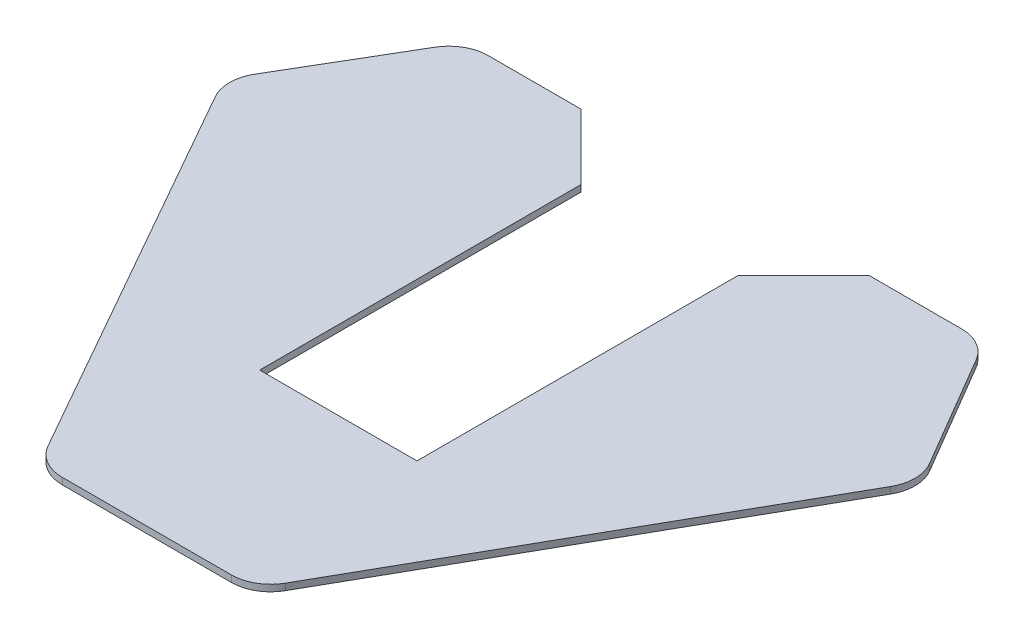
ISO-10303-21;
HEADER;
FILE_DESCRIPTION(('STEP AP214'),'2;1');
FILE_NAME('part.step','',(''),(''),'','','');
FILE_SCHEMA(('AUTOMOTIVE_DESIGN { 1 0 10303 214 1 1 1 1 }'));
ENDSEC;
DATA;
#1=APPLICATION_CONTEXT('core data for automotive mechanical design processes');
#2=APPLICATION_PROTOCOL_DEFINITION('international standard','automotive_design',2000,#1);
#3=PRODUCT_CONTEXT('',#1,'mechanical');
#4=PRODUCT('Part','Part','',(#3));
#5=PRODUCT_RELATED_PRODUCT_CATEGORY('part','',(#4));
#6=PRODUCT_DEFINITION_FORMATION('','',#4);
#7=PRODUCT_DEFINITION_CONTEXT('part definition',#1,'design');
#8=PRODUCT_DEFINITION('design','',#6,#7);
#9=PRODUCT_DEFINITION_SHAPE('','',#8);
#10=(LENGTH_UNIT() NAMED_UNIT(*) SI_UNIT(.MILLI.,.METRE.));
#11=(NAMED_UNIT(*) PLANE_ANGLE_UNIT() SI_UNIT($,.RADIAN.));
#12=(NAMED_UNIT(*) SI_UNIT($,.STERADIAN.) SOLID_ANGLE_UNIT());
#13=UNCERTAINTY_MEASURE_WITH_UNIT(LENGTH_MEASURE(1.E-05),#10,'distance_accuracy_value','');
#14=(GEOMETRIC_REPRESENTATION_CONTEXT(3) GLOBAL_UNCERTAINTY_ASSIGNED_CONTEXT((#13)) GLOBAL_UNIT_ASSIGNED_CONTEXT((#10,
#11,#12)) REPRESENTATION_CONTEXT('',''));
#15=CARTESIAN_POINT('',(0.,0.,0.));
#16=DIRECTION('',(0.,0.,1.));
#17=DIRECTION('',(1.,0.,0.));
#18=AXIS2_PLACEMENT_3D('',#15,#16,#17);
#19=CARTESIAN_POINT('',(-197.790744863456,5.,-180.));
#20=DIRECTION('',(0.,0.,1.));
#21=DIRECTION('',(1.,0.,0.));
#22=AXIS2_PLACEMENT_3D('',#19,#20,#21);
#23=PLANE('',#22);
#24=DIRECTION('',(-1.,0.,0.));
#25=VECTOR('',#24,1.);
#26=CARTESIAN_POINT('',(-197.790744863456,5.,-180.));
#27=LINE('',#26,#25);
#28=CARTESIAN_POINT('',(180.629047491506,5.,-180.));
#29=VERTEX_POINT('',#28);
#30=CARTESIAN_POINT('',(110.,5.,-180.));
#31=VERTEX_POINT('',#30);
#32=EDGE_CURVE('E234',#29,#31,#27,.T.);
#33=ORIENTED_EDGE('',*,*,#32,.F.);
#34=DIRECTION('',(0.,-1.,0.));
#35=VECTOR('',#34,1.);
#36=CARTESIAN_POINT('',(180.629047491506,5.,-180.));
#37=LINE('',#36,#35);
#38=CARTESIAN_POINT('',(180.629047491506,0.,-180.));
#39=VERTEX_POINT('',#38);
#40=EDGE_CURVE('E279',#29,#39,#37,.T.);
#41=ORIENTED_EDGE('',*,*,#40,.T.);
#42=DIRECTION('',(-1.,0.,0.));
#43=VECTOR('',#42,1.);
#44=CARTESIAN_POINT('',(-197.790744863456,0.,-180.));
#45=LINE('',#44,#43);
#46=CARTESIAN_POINT('',(110.,0.,-180.));
#47=VERTEX_POINT('',#46);
#48=EDGE_CURVE('E254',#39,#47,#45,.T.);
#49=ORIENTED_EDGE('',*,*,#48,.T.);
#50=DIRECTION('',(0.,-1.,0.));
#51=VECTOR('',#50,1.);
#52=CARTESIAN_POINT('',(110.,875.406040775609,-180.));
#53=LINE('',#52,#51);
#54=EDGE_CURVE('E224',#31,#47,#53,.T.);
#55=ORIENTED_EDGE('',*,*,#54,.F.);
#56=EDGE_LOOP('',(#33,#41,#49,#55));
#57=FACE_BOUND('',#56,.T.);
#58=ADVANCED_FACE('F41',(#57),#23,.F.);
#59=CARTESIAN_POINT('',(-110.,0.,-180.));
#60=VERTEX_POINT('',#59);
#61=CARTESIAN_POINT('',(-180.629047491506,0.,-180.));
#62=VERTEX_POINT('',#61);
#63=EDGE_CURVE('E233',#60,#62,#45,.T.);
#64=ORIENTED_EDGE('',*,*,#63,.T.);
#65=DIRECTION('',(0.,-1.,0.));
#66=VECTOR('',#65,1.);
#67=CARTESIAN_POINT('',(-180.629047491506,5.,-180.));
#68=LINE('',#67,#66);
#69=CARTESIAN_POINT('',(-180.629047491506,5.,-180.));
#70=VERTEX_POINT('',#69);
#71=EDGE_CURVE('E11',#62,#70,#68,.F.);
#72=ORIENTED_EDGE('',*,*,#71,.T.);
#73=CARTESIAN_POINT('',(-110.,5.,-180.));
#74=VERTEX_POINT('',#73);
#75=EDGE_CURVE('E237',#74,#70,#27,.T.);
#76=ORIENTED_EDGE('',*,*,#75,.F.);
#77=DIRECTION('',(0.,-1.,0.));
#78=VECTOR('',#77,1.);
#79=CARTESIAN_POINT('',(-110.,875.406040775609,-180.));
#80=LINE('',#79,#78);
#81=EDGE_CURVE('E220',#74,#60,#80,.T.);
#82=ORIENTED_EDGE('',*,*,#81,.T.);
#83=EDGE_LOOP('',(#64,#72,#76,#82));
#84=FACE_BOUND('',#83,.T.);
#85=ADVANCED_FACE('F411',(#84),#23,.F.);
#86=CARTESIAN_POINT('',(0.,5.,0.));
#87=DIRECTION('',(0.,-1.,0.));
#88=DIRECTION('',(0.,0.,-1.));
#89=AXIS2_PLACEMENT_3D('',#86,#87,#88);
#90=PLANE('',#89);
#91=DIRECTION('',(-0.506876559998709,0.,-0.86201864998611));
#92=VECTOR('',#91,1.);
#93=CARTESIAN_POINT('',(197.790744863456,5.,-180.));
#94=LINE('',#93,#92);
#95=CARTESIAN_POINT('',(257.350554493859,5.,-78.7097239391772));
#96=VERTEX_POINT('',#95);
#97=CARTESIAN_POINT('',(206.489606991089,5.,-165.206296799961));
#98=VERTEX_POINT('',#97);
#99=EDGE_CURVE('E250',#96,#98,#94,.T.);
#100=ORIENTED_EDGE('',*,*,#99,.T.);
#101=CARTESIAN_POINT('',(180.629047491506,5.,-150.));
#102=DIRECTION('',(0.,-1.,0.));
#103=DIRECTION('',(0.,0.,-1.));
#104=AXIS2_PLACEMENT_3D('',#101,#102,#103);
#105=CIRCLE('',#104,30.);
#106=EDGE_CURVE('E315',#98,#29,#105,.F.);
#107=ORIENTED_EDGE('',*,*,#106,.T.);
#108=ORIENTED_EDGE('',*,*,#32,.T.);
#109=DIRECTION('',(0.707106781186546,0.,-0.707106781186549));
#110=VECTOR('',#109,1.);
#111=CARTESIAN_POINT('',(-34.9999999999997,5.,-34.9999999999996));
#112=LINE('',#111,#110);
#113=CARTESIAN_POINT('',(60.,5.,-130.));
#114=VERTEX_POINT('',#113);
#115=EDGE_CURVE('E230',#114,#31,#112,.T.);
#116=ORIENTED_EDGE('',*,*,#115,.F.);
#117=DIRECTION('',(0.,0.,-1.));
#118=VECTOR('',#117,1.);
#119=CARTESIAN_POINT('',(60.,5.,115.));
#120=LINE('',#119,#118);
#121=CARTESIAN_POINT('',(60.,5.,115.));
#122=VERTEX_POINT('',#121);
#123=EDGE_CURVE('E205',#122,#114,#120,.T.);
#124=ORIENTED_EDGE('',*,*,#123,.F.);
#125=DIRECTION('',(1.,0.,0.));
#126=VECTOR('',#125,1.);
#127=CARTESIAN_POINT('',(-60.,5.,115.));
#128=LINE('',#127,#126);
#129=CARTESIAN_POINT('',(-60.,5.,115.));
#130=VERTEX_POINT('',#129);
#131=EDGE_CURVE('E188',#130,#122,#128,.T.);
#132=ORIENTED_EDGE('',*,*,#131,.F.);
#133=DIRECTION('',(0.,0.,1.));
#134=VECTOR('',#133,1.);
#135=CARTESIAN_POINT('',(-60.,5.,115.));
#136=LINE('',#135,#134);
#137=CARTESIAN_POINT('',(-60.,5.,-130.));
#138=VERTEX_POINT('',#137);
#139=EDGE_CURVE('E198',#138,#130,#136,.T.);
#140=ORIENTED_EDGE('',*,*,#139,.F.);
#141=DIRECTION('',(0.707106781186546,0.,0.707106781186549));
#142=VECTOR('',#141,1.);
#143=CARTESIAN_POINT('',(34.9999999999997,5.,-34.9999999999996));
#144=LINE('',#143,#142);
#145=EDGE_CURVE('E227',#74,#138,#144,.T.);
#146=ORIENTED_EDGE('',*,*,#145,.F.);
#147=ORIENTED_EDGE('',*,*,#75,.T.);
#148=CARTESIAN_POINT('',(-180.629047491506,5.,-150.));
#149=DIRECTION('',(0.,-1.,0.));
#150=DIRECTION('',(0.,0.,-1.));
#151=AXIS2_PLACEMENT_3D('',#148,#149,#150);
#152=CIRCLE('',#151,30.);
#153=CARTESIAN_POINT('',(-206.489606991089,5.,-165.206296799961));
#154=VERTEX_POINT('',#153);
#155=EDGE_CURVE('E303',#70,#154,#152,.F.);
#156=ORIENTED_EDGE('',*,*,#155,.T.);
#157=DIRECTION('',(-0.506876559998709,0.,0.86201864998611));
#158=VECTOR('',#157,1.);
#159=CARTESIAN_POINT('',(-197.790744863456,5.,-180.));
#160=LINE('',#159,#158);
#161=CARTESIAN_POINT('',(-257.350554493859,5.,-78.7097239391771));
#162=VERTEX_POINT('',#161);
#163=EDGE_CURVE('E236',#154,#162,#160,.T.);
#164=ORIENTED_EDGE('',*,*,#163,.T.);
#165=CARTESIAN_POINT('',(-231.489994994275,5.,-63.5034271392159));
#166=DIRECTION('',(0.,-1.,0.));
#167=DIRECTION('',(0.,0.,-1.));
#168=AXIS2_PLACEMENT_3D('',#165,#166,#167);
#169=CIRCLE('',#168,30.);
#170=CARTESIAN_POINT('',(-257.58931407032,5.,-48.7106740564783));
#171=VERTEX_POINT('',#170);
#172=EDGE_CURVE('E306',#162,#171,#169,.F.);
#173=ORIENTED_EDGE('',*,*,#172,.T.);
#174=DIRECTION('',(0.493091769424584,0.,0.869977302534803));
#175=VECTOR('',#174,1.);
#176=CARTESIAN_POINT('',(-266.129914044694,5.,-63.7791229506984));
#177=LINE('',#176,#175);
#178=CARTESIAN_POINT('',(-90.5892688805344,5.,245.932753082737));
#179=VERTEX_POINT('',#178);
#180=EDGE_CURVE('E241',#171,#179,#177,.T.);
#181=ORIENTED_EDGE('',*,*,#180,.T.);
#182=CARTESIAN_POINT('',(-64.4899498044903,5.,231.14));
#183=DIRECTION('',(0.,-1.,0.));
#184=DIRECTION('',(0.,0.,-1.));
#185=AXIS2_PLACEMENT_3D('',#182,#183,#184);
#186=CIRCLE('',#185,30.);
#187=CARTESIAN_POINT('',(-64.4899498044903,5.,261.14));
#188=VERTEX_POINT('',#187);
#189=EDGE_CURVE('E309',#179,#188,#186,.F.);
#190=ORIENTED_EDGE('',*,*,#189,.T.);
#191=DIRECTION('',(1.,0.,0.));
#192=VECTOR('',#191,1.);
#193=CARTESIAN_POINT('',(-81.97,5.,261.14));
#194=LINE('',#193,#192);
#195=CARTESIAN_POINT('',(64.4899498044903,5.,261.14));
#196=VERTEX_POINT('',#195);
#197=EDGE_CURVE('E245',#188,#196,#194,.T.);
#198=ORIENTED_EDGE('',*,*,#197,.T.);
#199=CARTESIAN_POINT('',(64.4899498044903,5.,231.14));
#200=DIRECTION('',(0.,-1.,0.));
#201=DIRECTION('',(0.,0.,-1.));
#202=AXIS2_PLACEMENT_3D('',#199,#200,#201);
#203=CIRCLE('',#202,30.);
#204=CARTESIAN_POINT('',(90.5892688805344,5.,245.932753082737));
#205=VERTEX_POINT('',#204);
#206=EDGE_CURVE('E64',#196,#205,#203,.F.);
#207=ORIENTED_EDGE('',*,*,#206,.T.);
#208=DIRECTION('',(0.493091769424584,0.,-0.869977302534803));
#209=VECTOR('',#208,1.);
#210=CARTESIAN_POINT('',(266.129914044694,5.,-63.7791229506984));
#211=LINE('',#210,#209);
#212=CARTESIAN_POINT('',(257.58931407032,5.,-48.7106740564783));
#213=VERTEX_POINT('',#212);
#214=EDGE_CURVE('E247',#205,#213,#211,.T.);
#215=ORIENTED_EDGE('',*,*,#214,.T.);
#216=CARTESIAN_POINT('',(231.489994994275,5.,-63.5034271392159));
#217=DIRECTION('',(0.,-1.,0.));
#218=DIRECTION('',(0.,0.,-1.));
#219=AXIS2_PLACEMENT_3D('',#216,#217,#218);
#220=CIRCLE('',#219,30.);
#221=EDGE_CURVE('E312',#213,#96,#220,.F.);
#222=ORIENTED_EDGE('',*,*,#221,.T.);
#223=EDGE_LOOP('',(#100,#107,#108,#116,#124,#132,#140,#146,#147,#156,#164,#173,#181,#190,#198,
#207,#215,#222));
#224=FACE_BOUND('',#223,.T.);
#225=ADVANCED_FACE('F208',(#224),#90,.F.);
#226=CARTESIAN_POINT('',(0.,0.,0.));
#227=DIRECTION('',(0.,-1.,0.));
#228=DIRECTION('',(0.,0.,-1.));
#229=AXIS2_PLACEMENT_3D('',#226,#227,#228);
#230=PLANE('',#229);
#231=ORIENTED_EDGE('',*,*,#48,.F.);
#232=CARTESIAN_POINT('',(180.629047491506,0.,-150.));
#233=DIRECTION('',(0.,-1.,0.));
#234=DIRECTION('',(0.,0.,-1.));
#235=AXIS2_PLACEMENT_3D('',#232,#233,#234);
#236=CIRCLE('',#235,30.);
#237=CARTESIAN_POINT('',(206.489606991089,0.,-165.206296799961));
#238=VERTEX_POINT('',#237);
#239=EDGE_CURVE('E295',#39,#238,#236,.T.);
#240=ORIENTED_EDGE('',*,*,#239,.T.);
#241=DIRECTION('',(-0.506876559998709,0.,-0.86201864998611));
#242=VECTOR('',#241,1.);
#243=CARTESIAN_POINT('',(197.790744863456,0.,-180.));
#244=LINE('',#243,#242);
#245=CARTESIAN_POINT('',(257.350554493859,0.,-78.7097239391772));
#246=VERTEX_POINT('',#245);
#247=EDGE_CURVE('E269',#246,#238,#244,.T.);
#248=ORIENTED_EDGE('',*,*,#247,.F.);
#249=CARTESIAN_POINT('',(231.489994994275,0.,-63.5034271392159));
#250=DIRECTION('',(0.,-1.,0.));
#251=DIRECTION('',(0.,0.,-1.));
#252=AXIS2_PLACEMENT_3D('',#249,#250,#251);
#253=CIRCLE('',#252,30.);
#254=CARTESIAN_POINT('',(257.58931407032,0.,-48.7106740564783));
#255=VERTEX_POINT('',#254);
#256=EDGE_CURVE('E292',#246,#255,#253,.T.);
#257=ORIENTED_EDGE('',*,*,#256,.T.);
#258=DIRECTION('',(0.493091769424584,0.,-0.869977302534803));
#259=VECTOR('',#258,1.);
#260=CARTESIAN_POINT('',(266.129914044694,0.,-63.7791229506984));
#261=LINE('',#260,#259);
#262=CARTESIAN_POINT('',(90.5892688805344,0.,245.932753082737));
#263=VERTEX_POINT('',#262);
#264=EDGE_CURVE('E267',#263,#255,#261,.T.);
#265=ORIENTED_EDGE('',*,*,#264,.F.);
#266=CARTESIAN_POINT('',(64.4899498044903,0.,231.14));
#267=DIRECTION('',(0.,-1.,0.));
#268=DIRECTION('',(0.,0.,-1.));
#269=AXIS2_PLACEMENT_3D('',#266,#267,#268);
#270=CIRCLE('',#269,30.);
#271=CARTESIAN_POINT('',(64.4899498044903,0.,261.14));
#272=VERTEX_POINT('',#271);
#273=EDGE_CURVE('E290',#263,#272,#270,.T.);
#274=ORIENTED_EDGE('',*,*,#273,.T.);
#275=DIRECTION('',(1.,0.,0.));
#276=VECTOR('',#275,1.);
#277=CARTESIAN_POINT('',(-81.97,0.,261.14));
#278=LINE('',#277,#276);
#279=CARTESIAN_POINT('',(-64.4899498044903,0.,261.14));
#280=VERTEX_POINT('',#279);
#281=EDGE_CURVE('E264',#280,#272,#278,.T.);
#282=ORIENTED_EDGE('',*,*,#281,.F.);
#283=CARTESIAN_POINT('',(-64.4899498044903,0.,231.14));
#284=DIRECTION('',(0.,-1.,0.));
#285=DIRECTION('',(0.,0.,-1.));
#286=AXIS2_PLACEMENT_3D('',#283,#284,#285);
#287=CIRCLE('',#286,30.);
#288=CARTESIAN_POINT('',(-90.5892688805344,0.,245.932753082737));
#289=VERTEX_POINT('',#288);
#290=EDGE_CURVE('E288',#280,#289,#287,.T.);
#291=ORIENTED_EDGE('',*,*,#290,.T.);
#292=DIRECTION('',(0.493091769424584,0.,0.869977302534803));
#293=VECTOR('',#292,1.);
#294=CARTESIAN_POINT('',(-266.129914044694,0.,-63.7791229506984));
#295=LINE('',#294,#293);
#296=CARTESIAN_POINT('',(-257.58931407032,0.,-48.7106740564783));
#297=VERTEX_POINT('',#296);
#298=EDGE_CURVE('E260',#297,#289,#295,.T.);
#299=ORIENTED_EDGE('',*,*,#298,.F.);
#300=CARTESIAN_POINT('',(-231.489994994275,0.,-63.5034271392159));
#301=DIRECTION('',(0.,-1.,0.));
#302=DIRECTION('',(0.,0.,-1.));
#303=AXIS2_PLACEMENT_3D('',#300,#301,#302);
#304=CIRCLE('',#303,30.);
#305=CARTESIAN_POINT('',(-257.350554493859,0.,-78.7097239391771));
#306=VERTEX_POINT('',#305);
#307=EDGE_CURVE('E285',#297,#306,#304,.T.);
#308=ORIENTED_EDGE('',*,*,#307,.T.);
#309=DIRECTION('',(-0.506876559998709,0.,0.86201864998611));
#310=VECTOR('',#309,1.);
#311=CARTESIAN_POINT('',(-197.790744863456,0.,-180.));
#312=LINE('',#311,#310);
#313=CARTESIAN_POINT('',(-206.489606991089,0.,-165.206296799961));
#314=VERTEX_POINT('',#313);
#315=EDGE_CURVE('E256',#314,#306,#312,.T.);
#316=ORIENTED_EDGE('',*,*,#315,.F.);
#317=CARTESIAN_POINT('',(-180.629047491506,0.,-150.));
#318=DIRECTION('',(0.,-1.,0.));
#319=DIRECTION('',(0.,0.,-1.));
#320=AXIS2_PLACEMENT_3D('',#317,#318,#319);
#321=CIRCLE('',#320,30.);
#322=EDGE_CURVE('E282',#314,#62,#321,.T.);
#323=ORIENTED_EDGE('',*,*,#322,.T.);
#324=ORIENTED_EDGE('',*,*,#63,.F.);
#325=DIRECTION('',(0.707106781186546,0.,0.707106781186549));
#326=VECTOR('',#325,1.);
#327=CARTESIAN_POINT('',(34.9999999999997,0.,-34.9999999999996));
#328=LINE('',#327,#326);
#329=CARTESIAN_POINT('',(-60.,0.,-130.));
#330=VERTEX_POINT('',#329);
#331=EDGE_CURVE('E253',#60,#330,#328,.T.);
#332=ORIENTED_EDGE('',*,*,#331,.T.);
#333=DIRECTION('',(0.,0.,1.));
#334=VECTOR('',#333,1.);
#335=CARTESIAN_POINT('',(-60.,0.,115.));
#336=LINE('',#335,#334);
#337=CARTESIAN_POINT('',(-60.,0.,115.));
#338=VERTEX_POINT('',#337);
#339=EDGE_CURVE('E216',#330,#338,#336,.T.);
#340=ORIENTED_EDGE('',*,*,#339,.T.);
#341=DIRECTION('',(1.,0.,0.));
#342=VECTOR('',#341,1.);
#343=CARTESIAN_POINT('',(-60.,0.,115.));
#344=LINE('',#343,#342);
#345=CARTESIAN_POINT('',(60.,0.,115.));
#346=VERTEX_POINT('',#345);
#347=EDGE_CURVE('E191',#338,#346,#344,.T.);
#348=ORIENTED_EDGE('',*,*,#347,.T.);
#349=DIRECTION('',(0.,0.,-1.));
#350=VECTOR('',#349,1.);
#351=CARTESIAN_POINT('',(60.,0.,115.));
#352=LINE('',#351,#350);
#353=CARTESIAN_POINT('',(60.,0.,-130.));
#354=VERTEX_POINT('',#353);
#355=EDGE_CURVE('E390',#346,#354,#352,.T.);
#356=ORIENTED_EDGE('',*,*,#355,.T.);
#357=DIRECTION('',(0.707106781186546,0.,-0.707106781186549));
#358=VECTOR('',#357,1.);
#359=CARTESIAN_POINT('',(-34.9999999999997,0.,-34.9999999999996));
#360=LINE('',#359,#358);
#361=EDGE_CURVE('E276',#354,#47,#360,.T.);
#362=ORIENTED_EDGE('',*,*,#361,.T.);
#363=EDGE_LOOP('',(#231,#240,#248,#257,#265,#274,#282,#291,#299,#308,#316,#323,#324,#332,#340,
#348,#356,#362));
#364=FACE_BOUND('',#363,.T.);
#365=ADVANCED_FACE('F356',(#364),#230,.T.);
#366=CARTESIAN_POINT('',(-197.790744863456,5.,-180.));
#367=DIRECTION('',(0.86201864998611,0.,0.506876559998709));
#368=DIRECTION('',(0.506876559998709,0.,-0.86201864998611));
#369=AXIS2_PLACEMENT_3D('',#366,#367,#368);
#370=PLANE('',#369);
#371=ORIENTED_EDGE('',*,*,#315,.T.);
#372=DIRECTION('',(0.,-1.,0.));
#373=VECTOR('',#372,1.);
#374=CARTESIAN_POINT('',(-257.350554493859,5.,-78.7097239391771));
#375=LINE('',#374,#373);
#376=EDGE_CURVE('E50',#306,#162,#375,.F.);
#377=ORIENTED_EDGE('',*,*,#376,.T.);
#378=ORIENTED_EDGE('',*,*,#163,.F.);
#379=DIRECTION('',(0.,-1.,0.));
#380=VECTOR('',#379,1.);
#381=CARTESIAN_POINT('',(-206.489606991089,5.,-165.206296799961));
#382=LINE('',#381,#380);
#383=EDGE_CURVE('E333',#154,#314,#382,.T.);
#384=ORIENTED_EDGE('',*,*,#383,.T.);
#385=EDGE_LOOP('',(#371,#377,#378,#384));
#386=FACE_BOUND('',#385,.T.);
#387=ADVANCED_FACE('F340',(#386),#370,.F.);
#388=CARTESIAN_POINT('',(-266.129914044694,5.,-63.7791229506984));
#389=DIRECTION('',(0.869977302534803,0.,-0.493091769424584));
#390=DIRECTION('',(-0.493091769424584,0.,-0.869977302534803));
#391=AXIS2_PLACEMENT_3D('',#388,#389,#390);
#392=PLANE('',#391);
#393=ORIENTED_EDGE('',*,*,#298,.T.);
#394=DIRECTION('',(0.,-1.,0.));
#395=VECTOR('',#394,1.);
#396=CARTESIAN_POINT('',(-90.5892688805344,5.,245.932753082738));
#397=LINE('',#396,#395);
#398=EDGE_CURVE('E331',#289,#179,#397,.F.);
#399=ORIENTED_EDGE('',*,*,#398,.T.);
#400=ORIENTED_EDGE('',*,*,#180,.F.);
#401=DIRECTION('',(0.,-1.,0.));
#402=VECTOR('',#401,1.);
#403=CARTESIAN_POINT('',(-257.58931407032,5.,-48.7106740564783));
#404=LINE('',#403,#402);
#405=EDGE_CURVE('E327',#171,#297,#404,.T.);
#406=ORIENTED_EDGE('',*,*,#405,.T.);
#407=EDGE_LOOP('',(#393,#399,#400,#406));
#408=FACE_BOUND('',#407,.T.);
#409=ADVANCED_FACE('F352',(#408),#392,.F.);
#410=CARTESIAN_POINT('',(-81.97,5.,261.14));
#411=DIRECTION('',(0.,0.,-1.));
#412=DIRECTION('',(-1.,0.,0.));
#413=AXIS2_PLACEMENT_3D('',#410,#411,#412);
#414=PLANE('',#413);
#415=ORIENTED_EDGE('',*,*,#281,.T.);
#416=DIRECTION('',(0.,-1.,0.));
#417=VECTOR('',#416,1.);
#418=CARTESIAN_POINT('',(64.4899498044903,5.,261.14));
#419=LINE('',#418,#417);
#420=EDGE_CURVE('E325',#272,#196,#419,.F.);
#421=ORIENTED_EDGE('',*,*,#420,.T.);
#422=ORIENTED_EDGE('',*,*,#197,.F.);
#423=DIRECTION('',(0.,-1.,0.));
#424=VECTOR('',#423,1.);
#425=CARTESIAN_POINT('',(-64.4899498044903,5.,261.14));
#426=LINE('',#425,#424);
#427=EDGE_CURVE('E322',#188,#280,#426,.T.);
#428=ORIENTED_EDGE('',*,*,#427,.T.);
#429=EDGE_LOOP('',(#415,#421,#422,#428));
#430=FACE_BOUND('',#429,.T.);
#431=ADVANCED_FACE('F364',(#430),#414,.F.);
#432=CARTESIAN_POINT('',(266.129914044694,5.,-63.7791229506984));
#433=DIRECTION('',(-0.869977302534803,0.,-0.493091769424584));
#434=DIRECTION('',(-0.493091769424584,0.,0.869977302534803));
#435=AXIS2_PLACEMENT_3D('',#432,#433,#434);
#436=PLANE('',#435);
#437=ORIENTED_EDGE('',*,*,#264,.T.);
#438=DIRECTION('',(0.,-1.,0.));
#439=VECTOR('',#438,1.);
#440=CARTESIAN_POINT('',(257.58931407032,5.,-48.7106740564783));
#441=LINE('',#440,#439);
#442=EDGE_CURVE('E57',#255,#213,#441,.F.);
#443=ORIENTED_EDGE('',*,*,#442,.T.);
#444=ORIENTED_EDGE('',*,*,#214,.F.);
#445=DIRECTION('',(0.,-1.,0.));
#446=VECTOR('',#445,1.);
#447=CARTESIAN_POINT('',(90.5892688805344,5.,245.932753082738));
#448=LINE('',#447,#446);
#449=EDGE_CURVE('E317',#205,#263,#448,.T.);
#450=ORIENTED_EDGE('',*,*,#449,.T.);
#451=EDGE_LOOP('',(#437,#443,#444,#450));
#452=FACE_BOUND('',#451,.T.);
#453=ADVANCED_FACE('F370',(#452),#436,.F.);
#454=CARTESIAN_POINT('',(197.790744863456,5.,-180.));
#455=DIRECTION('',(-0.86201864998611,0.,0.506876559998709));
#456=DIRECTION('',(0.506876559998709,0.,0.86201864998611));
#457=AXIS2_PLACEMENT_3D('',#454,#455,#456);
#458=PLANE('',#457);
#459=ORIENTED_EDGE('',*,*,#247,.T.);
#460=DIRECTION('',(0.,-1.,0.));
#461=VECTOR('',#460,1.);
#462=CARTESIAN_POINT('',(206.489606991089,5.,-165.206296799961));
#463=LINE('',#462,#461);
#464=EDGE_CURVE('E301',#238,#98,#463,.F.);
#465=ORIENTED_EDGE('',*,*,#464,.T.);
#466=ORIENTED_EDGE('',*,*,#99,.F.);
#467=DIRECTION('',(0.,-1.,0.));
#468=VECTOR('',#467,1.);
#469=CARTESIAN_POINT('',(257.350554493859,5.,-78.7097239391771));
#470=LINE('',#469,#468);
#471=EDGE_CURVE('E297',#96,#246,#470,.T.);
#472=ORIENTED_EDGE('',*,*,#471,.T.);
#473=EDGE_LOOP('',(#459,#465,#466,#472));
#474=FACE_BOUND('',#473,.T.);
#475=ADVANCED_FACE('F378',(#474),#458,.F.);
#476=CARTESIAN_POINT('',(110.,875.406040775609,-180.));
#477=DIRECTION('',(-0.707106781186549,0.,-0.707106781186546));
#478=DIRECTION('',(-0.707106781186546,0.,0.707106781186549));
#479=AXIS2_PLACEMENT_3D('',#476,#477,#478);
#480=PLANE('',#479);
#481=DIRECTION('',(0.,1.,0.));
#482=VECTOR('',#481,1.);
#483=CARTESIAN_POINT('',(60.,-0.00100000000000013,-130.));
#484=LINE('',#483,#482);
#485=EDGE_CURVE('E394',#354,#114,#484,.T.);
#486=ORIENTED_EDGE('',*,*,#485,.T.);
#487=ORIENTED_EDGE('',*,*,#115,.T.);
#488=ORIENTED_EDGE('',*,*,#54,.T.);
#489=ORIENTED_EDGE('',*,*,#361,.F.);
#490=EDGE_LOOP('',(#486,#487,#488,#489));
#491=FACE_BOUND('',#490,.T.);
#492=ADVANCED_FACE('F393',(#491),#480,.T.);
#493=CARTESIAN_POINT('',(-110.,875.406040775609,-180.));
#494=DIRECTION('',(0.707106781186549,0.,-0.707106781186546));
#495=DIRECTION('',(-0.707106781186546,0.,-0.707106781186549));
#496=AXIS2_PLACEMENT_3D('',#493,#494,#495);
#497=PLANE('',#496);
#498=DIRECTION('',(0.,-1.,0.));
#499=VECTOR('',#498,1.);
#500=CARTESIAN_POINT('',(-60.,-0.00100000000000013,-130.));
#501=LINE('',#500,#499);
#502=EDGE_CURVE('E201',#138,#330,#501,.T.);
#503=ORIENTED_EDGE('',*,*,#502,.T.);
#504=ORIENTED_EDGE('',*,*,#331,.F.);
#505=ORIENTED_EDGE('',*,*,#81,.F.);
#506=ORIENTED_EDGE('',*,*,#145,.T.);
#507=EDGE_LOOP('',(#503,#504,#505,#506));
#508=FACE_BOUND('',#507,.T.);
#509=ADVANCED_FACE('F407',(#508),#497,.T.);
#510=CARTESIAN_POINT('',(60.,-0.00100000000000013,115.));
#511=DIRECTION('',(1.,0.,0.));
#512=DIRECTION('',(0.,0.,-1.));
#513=AXIS2_PLACEMENT_3D('',#510,#511,#512);
#514=PLANE('',#513);
#515=DIRECTION('',(0.,1.,0.));
#516=VECTOR('',#515,1.);
#517=CARTESIAN_POINT('',(60.,-0.00100000000000013,115.));
#518=LINE('',#517,#516);
#519=EDGE_CURVE('E195',#346,#122,#518,.T.);
#520=ORIENTED_EDGE('',*,*,#519,.T.);
#521=ORIENTED_EDGE('',*,*,#123,.T.);
#522=ORIENTED_EDGE('',*,*,#485,.F.);
#523=ORIENTED_EDGE('',*,*,#355,.F.);
#524=EDGE_LOOP('',(#520,#521,#522,#523));
#525=FACE_BOUND('',#524,.T.);
#526=ADVANCED_FACE('F404',(#525),#514,.F.);
#527=CARTESIAN_POINT('',(-60.,-0.00100000000000013,115.));
#528=DIRECTION('',(0.,0.,1.));
#529=DIRECTION('',(1.,0.,0.));
#530=AXIS2_PLACEMENT_3D('',#527,#528,#529);
#531=PLANE('',#530);
#532=DIRECTION('',(0.,1.,0.));
#533=VECTOR('',#532,1.);
#534=CARTESIAN_POINT('',(-60.,-0.00100000000000013,115.));
#535=LINE('',#534,#533);
#536=EDGE_CURVE('E184',#338,#130,#535,.T.);
#537=ORIENTED_EDGE('',*,*,#536,.T.);
#538=ORIENTED_EDGE('',*,*,#131,.T.);
#539=ORIENTED_EDGE('',*,*,#519,.F.);
#540=ORIENTED_EDGE('',*,*,#347,.F.);
#541=EDGE_LOOP('',(#537,#538,#539,#540));
#542=FACE_BOUND('',#541,.T.);
#543=ADVANCED_FACE('F186',(#542),#531,.F.);
#544=CARTESIAN_POINT('',(-60.,-0.00100000000000013,115.));
#545=DIRECTION('',(-1.,0.,0.));
#546=DIRECTION('',(0.,0.,1.));
#547=AXIS2_PLACEMENT_3D('',#544,#545,#546);
#548=PLANE('',#547);
#549=ORIENTED_EDGE('',*,*,#502,.F.);
#550=ORIENTED_EDGE('',*,*,#139,.T.);
#551=ORIENTED_EDGE('',*,*,#536,.F.);
#552=ORIENTED_EDGE('',*,*,#339,.F.);
#553=EDGE_LOOP('',(#549,#550,#551,#552));
#554=FACE_BOUND('',#553,.T.);
#555=ADVANCED_FACE('F199',(#554),#548,.F.);
#556=CARTESIAN_POINT('',(180.629047491506,5.,-150.));
#557=DIRECTION('',(0.,-1.,0.));
#558=DIRECTION('',(0.,0.,-1.));
#559=AXIS2_PLACEMENT_3D('',#556,#557,#558);
#560=CYLINDRICAL_SURFACE('',#559,30.);
#561=ORIENTED_EDGE('',*,*,#106,.F.);
#562=ORIENTED_EDGE('',*,*,#464,.F.);
#563=ORIENTED_EDGE('',*,*,#239,.F.);
#564=ORIENTED_EDGE('',*,*,#40,.F.);
#565=EDGE_LOOP('',(#561,#562,#563,#564));
#566=FACE_BOUND('',#565,.T.);
#567=ADVANCED_FACE('F384',(#566),#560,.T.);
#568=CARTESIAN_POINT('',(231.489994994275,5.,-63.5034271392159));
#569=DIRECTION('',(0.,-1.,0.));
#570=DIRECTION('',(0.,0.,-1.));
#571=AXIS2_PLACEMENT_3D('',#568,#569,#570);
#572=CYLINDRICAL_SURFACE('',#571,30.);
#573=ORIENTED_EDGE('',*,*,#221,.F.);
#574=ORIENTED_EDGE('',*,*,#442,.F.);
#575=ORIENTED_EDGE('',*,*,#256,.F.);
#576=ORIENTED_EDGE('',*,*,#471,.F.);
#577=EDGE_LOOP('',(#573,#574,#575,#576));
#578=FACE_BOUND('',#577,.T.);
#579=ADVANCED_FACE('F375',(#578),#572,.T.);
#580=CARTESIAN_POINT('',(64.4899498044903,5.,231.14));
#581=DIRECTION('',(0.,-1.,0.));
#582=DIRECTION('',(0.,0.,-1.));
#583=AXIS2_PLACEMENT_3D('',#580,#581,#582);
#584=CYLINDRICAL_SURFACE('',#583,30.);
#585=ORIENTED_EDGE('',*,*,#206,.F.);
#586=ORIENTED_EDGE('',*,*,#420,.F.);
#587=ORIENTED_EDGE('',*,*,#273,.F.);
#588=ORIENTED_EDGE('',*,*,#449,.F.);
#589=EDGE_LOOP('',(#585,#586,#587,#588));
#590=FACE_BOUND('',#589,.T.);
#591=ADVANCED_FACE('F368',(#590),#584,.T.);
#592=CARTESIAN_POINT('',(-64.4899498044903,5.,231.14));
#593=DIRECTION('',(0.,-1.,0.));
#594=DIRECTION('',(0.,0.,-1.));
#595=AXIS2_PLACEMENT_3D('',#592,#593,#594);
#596=CYLINDRICAL_SURFACE('',#595,30.);
#597=ORIENTED_EDGE('',*,*,#189,.F.);
#598=ORIENTED_EDGE('',*,*,#398,.F.);
#599=ORIENTED_EDGE('',*,*,#290,.F.);
#600=ORIENTED_EDGE('',*,*,#427,.F.);
#601=EDGE_LOOP('',(#597,#598,#599,#600));
#602=FACE_BOUND('',#601,.T.);
#603=ADVANCED_FACE('F361',(#602),#596,.T.);
#604=CARTESIAN_POINT('',(-231.489994994275,5.,-63.5034271392159));
#605=DIRECTION('',(0.,-1.,0.));
#606=DIRECTION('',(0.,0.,-1.));
#607=AXIS2_PLACEMENT_3D('',#604,#605,#606);
#608=CYLINDRICAL_SURFACE('',#607,30.);
#609=ORIENTED_EDGE('',*,*,#172,.F.);
#610=ORIENTED_EDGE('',*,*,#376,.F.);
#611=ORIENTED_EDGE('',*,*,#307,.F.);
#612=ORIENTED_EDGE('',*,*,#405,.F.);
#613=EDGE_LOOP('',(#609,#610,#611,#612));
#614=FACE_BOUND('',#613,.T.);
#615=ADVANCED_FACE('F349',(#614),#608,.T.);
#616=CARTESIAN_POINT('',(-180.629047491506,5.,-150.));
#617=DIRECTION('',(0.,-1.,0.));
#618=DIRECTION('',(0.,0.,-1.));
#619=AXIS2_PLACEMENT_3D('',#616,#617,#618);
#620=CYLINDRICAL_SURFACE('',#619,30.);
#621=ORIENTED_EDGE('',*,*,#155,.F.);
#622=ORIENTED_EDGE('',*,*,#71,.F.);
#623=ORIENTED_EDGE('',*,*,#322,.F.);
#624=ORIENTED_EDGE('',*,*,#383,.F.);
#625=EDGE_LOOP('',(#621,#622,#623,#624));
#626=FACE_BOUND('',#625,.T.);
#627=ADVANCED_FACE('F43',(#626),#620,.T.);
#628=CLOSED_SHELL('',(#58,#85,#225,#365,#387,#409,#431,#453,#475,#492,#509,#526,#543,#555,#567,
#579,#591,#603,#615,#627));
#629=MANIFOLD_SOLID_BREP('B2',#628);
#630=ADVANCED_BREP_SHAPE_REPRESENTATION('',(#18,#629),#14);
#631=SHAPE_DEFINITION_REPRESENTATION(#9,#630);
ENDSEC;
END-ISO-10303-21;
